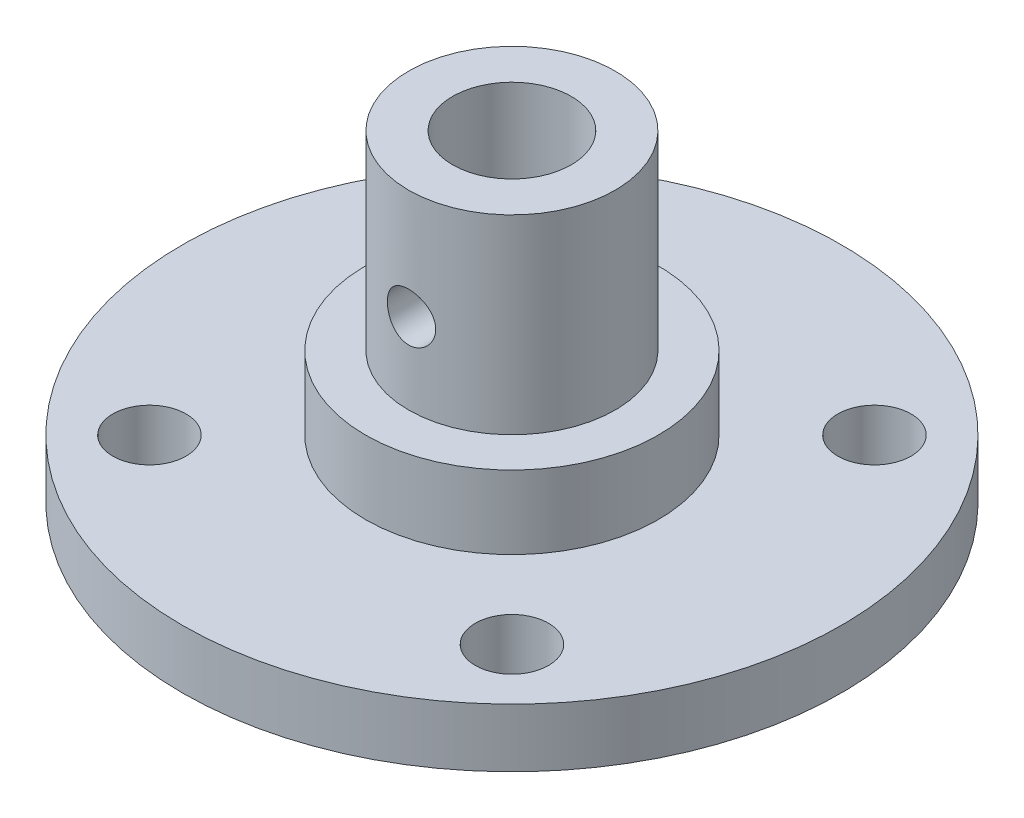
ISO-10303-21;
HEADER;
FILE_DESCRIPTION(('STEP AP214'),'2;1');
FILE_NAME('part.step','',(''),(''),'','','');
FILE_SCHEMA(('AUTOMOTIVE_DESIGN { 1 0 10303 214 1 1 1 1 }'));
ENDSEC;
DATA;
#1=APPLICATION_CONTEXT('core data for automotive mechanical design processes');
#2=APPLICATION_PROTOCOL_DEFINITION('international standard','automotive_design',2000,#1);
#3=PRODUCT_CONTEXT('',#1,'mechanical');
#4=PRODUCT('Part','Part','',(#3));
#5=PRODUCT_RELATED_PRODUCT_CATEGORY('part','',(#4));
#6=PRODUCT_DEFINITION_FORMATION('','',#4);
#7=PRODUCT_DEFINITION_CONTEXT('part definition',#1,'design');
#8=PRODUCT_DEFINITION('design','',#6,#7);
#9=PRODUCT_DEFINITION_SHAPE('','',#8);
#10=(LENGTH_UNIT() NAMED_UNIT(*) SI_UNIT(.MILLI.,.METRE.));
#11=(NAMED_UNIT(*) PLANE_ANGLE_UNIT() SI_UNIT($,.RADIAN.));
#12=(NAMED_UNIT(*) SI_UNIT($,.STERADIAN.) SOLID_ANGLE_UNIT());
#13=UNCERTAINTY_MEASURE_WITH_UNIT(LENGTH_MEASURE(1.E-05),#10,'distance_accuracy_value','');
#14=(GEOMETRIC_REPRESENTATION_CONTEXT(3) GLOBAL_UNCERTAINTY_ASSIGNED_CONTEXT((#13)) GLOBAL_UNIT_ASSIGNED_CONTEXT((#10,
#11,#12)) REPRESENTATION_CONTEXT('',''));
#15=CARTESIAN_POINT('',(0.,0.,0.));
#16=DIRECTION('',(0.,0.,1.));
#17=DIRECTION('',(1.,0.,0.));
#18=AXIS2_PLACEMENT_3D('',#15,#16,#17);
#19=CARTESIAN_POINT('',(0.,22.,0.));
#20=DIRECTION('',(0.,1.,0.));
#21=DIRECTION('',(0.,0.,1.));
#22=AXIS2_PLACEMENT_3D('',#19,#20,#21);
#23=PLANE('',#22);
#24=CARTESIAN_POINT('',(0.,22.,0.));
#25=DIRECTION('',(0.,1.,0.));
#26=DIRECTION('',(0.,0.,1.));
#27=AXIS2_PLACEMENT_3D('',#24,#25,#26);
#28=CIRCLE('',#27,7.05);
#29=CARTESIAN_POINT('',(0.,22.,7.05));
#30=VERTEX_POINT('',#29);
#31=EDGE_CURVE('E143',#30,#30,#28,.T.);
#32=ORIENTED_EDGE('',*,*,#31,.T.);
#33=EDGE_LOOP('',(#32));
#34=FACE_BOUND('',#33,.T.);
#35=CARTESIAN_POINT('',(0.,22.,0.));
#36=DIRECTION('',(0.,1.,0.));
#37=DIRECTION('',(0.,0.,1.));
#38=AXIS2_PLACEMENT_3D('',#35,#36,#37);
#39=CIRCLE('',#38,4.05);
#40=CARTESIAN_POINT('',(0.,22.,4.05));
#41=VERTEX_POINT('',#40);
#42=EDGE_CURVE('E146',#41,#41,#39,.T.);
#43=ORIENTED_EDGE('',*,*,#42,.F.);
#44=EDGE_LOOP('',(#43));
#45=FACE_BOUND('',#44,.T.);
#46=ADVANCED_FACE('F37',(#34,#45),#23,.T.);
#47=CARTESIAN_POINT('',(0.,22.,0.));
#48=DIRECTION('',(0.,-1.,0.));
#49=DIRECTION('',(0.,0.,-1.));
#50=AXIS2_PLACEMENT_3D('',#47,#48,#49);
#51=CYLINDRICAL_SURFACE('',#50,7.05);
#52=CARTESIAN_POINT('',(0.,9.,0.));
#53=DIRECTION('',(0.,1.,0.));
#54=DIRECTION('',(0.,0.,1.));
#55=AXIS2_PLACEMENT_3D('',#52,#53,#54);
#56=CIRCLE('',#55,7.05);
#57=CARTESIAN_POINT('',(0.,9.,7.05));
#58=VERTEX_POINT('',#57);
#59=EDGE_CURVE('E41',#58,#58,#56,.T.);
#60=ORIENTED_EDGE('',*,*,#59,.T.);
#61=EDGE_LOOP('',(#60));
#62=FACE_BOUND('',#61,.T.);
#63=CARTESIAN_POINT('',(0.,16.15,-7.05));
#64=CARTESIAN_POINT('',(-0.0913474700441348,16.1499971257763,-7.04999835860839));
#65=CARTESIAN_POINT('',(-0.182728370967816,16.1423886431707,-7.04820672795841));
#66=CARTESIAN_POINT('',(-0.362883424808443,16.1121939383691,-7.04123285601421));
#67=CARTESIAN_POINT('',(-0.451655859508663,16.0895980650277,-7.03604842995472));
#68=CARTESIAN_POINT('',(-0.623965308754749,16.0301838366564,-7.02286472515679));
#69=CARTESIAN_POINT('',(-0.707508062710386,15.9933814025818,-7.01486859831513));
#70=CARTESIAN_POINT('',(-0.867232140467942,15.9066519235238,-6.99691905683074));
#71=CARTESIAN_POINT('',(-0.943413443157087,15.8567248409002,-6.98696563657471));
#72=CARTESIAN_POINT('',(-1.08764132660066,15.7442016679426,-6.9659845226797));
#73=CARTESIAN_POINT('',(-1.15553464496812,15.6814118953389,-6.95494193286553));
#74=CARTESIAN_POINT('',(-1.27992887383878,15.5453609823451,-6.933129115818));
#75=CARTESIAN_POINT('',(-1.33642864624293,15.4720987971156,-6.92235891588752));
#76=CARTESIAN_POINT('',(-1.43712923093335,15.3160225773181,-6.90216195699853));
#77=CARTESIAN_POINT('',(-1.48116296040951,15.2330980595042,-6.89275420570171));
#78=CARTESIAN_POINT('',(-1.55460848062976,15.0607689192231,-6.87656283506016));
#79=CARTESIAN_POINT('',(-1.58402229510892,14.9713651955924,-6.8697788525539));
#80=CARTESIAN_POINT('',(-1.62687874323924,14.7902891154612,-6.85975553519765));
#81=CARTESIAN_POINT('',(-1.64059477293359,14.6986848943786,-6.85645560287989));
#82=CARTESIAN_POINT('',(-1.65251712844868,14.5144207265445,-6.85359231982514));
#83=CARTESIAN_POINT('',(-1.65072564940748,14.4217609310675,-6.85402844023769));
#84=CARTESIAN_POINT('',(-1.6319029576016,14.2400777279802,-6.85853330792528));
#85=CARTESIAN_POINT('',(-1.61519316183075,14.1510188292118,-6.86252543645042));
#86=CARTESIAN_POINT('',(-1.56751904908242,13.9770046901947,-6.87357091579183));
#87=CARTESIAN_POINT('',(-1.53655382934907,13.8920497102122,-6.88062446047737));
#88=CARTESIAN_POINT('',(-1.46096288699098,13.7277712397107,-6.8970710476079));
#89=CARTESIAN_POINT('',(-1.41621688538256,13.64850522797,-6.90648454762436));
#90=CARTESIAN_POINT('',(-1.31441889943461,13.4984895881465,-6.92657831681793));
#91=CARTESIAN_POINT('',(-1.25736500976729,13.4277412812956,-6.93725878201278));
#92=CARTESIAN_POINT('',(-1.13088665465024,13.2949227773724,-6.95900891879344));
#93=CARTESIAN_POINT('',(-1.06118983333304,13.2331121491263,-6.97008166406616));
#94=CARTESIAN_POINT('',(-0.912290546931962,13.1220106913987,-6.9911279966374));
#95=CARTESIAN_POINT('',(-0.833087857773505,13.0727201571293,-7.00110155801506));
#96=CARTESIAN_POINT('',(-0.66708298943552,12.9879793338773,-7.01886589671544));
#97=CARTESIAN_POINT('',(-0.580260800099777,12.9525669084663,-7.02665068631667));
#98=CARTESIAN_POINT('',(-0.401674346249151,12.8969087908001,-7.03911638744719));
#99=CARTESIAN_POINT('',(-0.309910909998653,12.8766605651137,-7.04379781742919));
#100=CARTESIAN_POINT('',(-0.126269821770627,12.8522920786898,-7.04945414064618));
#101=CARTESIAN_POINT('',(-0.0344415890932761,12.8478177788424,-7.05051038504334));
#102=CARTESIAN_POINT('',(0.148650642925593,12.8541591326668,-7.04902706454207));
#103=CARTESIAN_POINT('',(0.239914685853824,12.8649735899905,-7.04648778099437));
#104=CARTESIAN_POINT('',(0.418087696494507,12.9012926283553,-7.03815044631055));
#105=CARTESIAN_POINT('',(0.505037379117772,12.9266079764561,-7.0323943963023));
#106=CARTESIAN_POINT('',(0.673454249383516,12.9909972594119,-7.01826955541532));
#107=CARTESIAN_POINT('',(0.754920925213545,13.030072476569,-7.00990052103704));
#108=CARTESIAN_POINT('',(0.911497111519642,13.1215853734508,-6.99127988281069));
#109=CARTESIAN_POINT('',(0.986484342548582,13.1742264564218,-6.98100035270794));
#110=CARTESIAN_POINT('',(1.12668736546317,13.2911127510514,-6.95974945986698));
#111=CARTESIAN_POINT('',(1.19190168828445,13.3553597041107,-6.94877799346833));
#112=CARTESIAN_POINT('',(1.31213592520768,13.4952684490656,-6.92709306514746));
#113=CARTESIAN_POINT('',(1.36690905897123,13.5711442638435,-6.91639007929237));
#114=CARTESIAN_POINT('',(1.46293971939007,13.7312232989828,-6.89671803932893));
#115=CARTESIAN_POINT('',(1.50419784943088,13.8154261473602,-6.88774890781893));
#116=CARTESIAN_POINT('',(1.57173173188878,13.9893092215103,-6.87265287252573));
#117=CARTESIAN_POINT('',(1.59809511700833,14.0789538990571,-6.86650938479602));
#118=CARTESIAN_POINT('',(1.63533738775271,14.2615658218623,-6.85773610515183));
#119=CARTESIAN_POINT('',(1.64621917073758,14.3545324420843,-6.85510565578282));
#120=CARTESIAN_POINT('',(1.65205242631933,14.5386506503708,-6.85370189893119));
#121=CARTESIAN_POINT('',(1.64739657048112,14.6297892857877,-6.85483351275164));
#122=CARTESIAN_POINT('',(1.62317444128206,14.8099438799284,-6.86060907154148));
#123=CARTESIAN_POINT('',(1.6036083991977,14.8989598715549,-6.86525296203084));
#124=CARTESIAN_POINT('',(1.55032310233551,15.0719758811152,-6.87748025111632));
#125=CARTESIAN_POINT('',(1.51666884456929,15.1559969360361,-6.88505013827433));
#126=CARTESIAN_POINT('',(1.43621561740372,15.317255708572,-6.90228003695973));
#127=CARTESIAN_POINT('',(1.38941505647352,15.3944926033891,-6.91194030152192));
#128=CARTESIAN_POINT('',(1.28272927430207,15.5419084276022,-6.93254039759688));
#129=CARTESIAN_POINT('',(1.2225676506912,15.6118839589951,-6.943504565116));
#130=CARTESIAN_POINT('',(1.09141763398933,15.7408744439888,-6.96532256366448));
#131=CARTESIAN_POINT('',(1.02042671551188,15.7998868338524,-6.9761763683259));
#132=CARTESIAN_POINT('',(0.868320199475794,15.9061503219366,-6.99674874586923));
#133=CARTESIAN_POINT('',(0.787066062769018,15.9532072317988,-7.00644736281726));
#134=CARTESIAN_POINT('',(0.617586058083398,16.0329194295174,-7.02341195451035));
#135=CARTESIAN_POINT('',(0.529365703639534,16.0655859747891,-7.03067982972086));
#136=CARTESIAN_POINT('',(0.367639236213593,16.1102242514875,-7.0407714154155));
#137=CARTESIAN_POINT('',(0.294961669974412,16.125109954214,-7.04420961291994));
#138=CARTESIAN_POINT('',(0.148196682842116,16.1449987097926,-7.04882450591003));
#139=CARTESIAN_POINT('',(0.0741093433969945,16.1500023318307,-7.05000133164558));
#140=CARTESIAN_POINT('',(0.,16.15,-7.05));
#141=B_SPLINE_CURVE_WITH_KNOTS('',3,(#63,#64,#65,#66,#67,#68,#69,#70,#71,#72,#73,#74,#75,#76,
#77,#78,#79,#80,#81,#82,#83,#84,#85,#86,#87,#88,#89,#90,#91,#92,#93,#94,#95,#96,#97,#98,#99,
#100,#101,#102,#103,#104,#105,#106,#107,#108,#109,#110,#111,#112,#113,#114,#115,#116,#117,#118,
#119,#120,#121,#122,#123,#124,#125,#126,#127,#128,#129,#130,#131,#132,#133,#134,#135,#136,#137,
#138,#139,#140),.UNSPECIFIED.,.T.,.F.,(4,2,2,2,2,2,2,2,2,2,2,2,2,2,2,2,2,2,2,2,2,2,2,2,2,2,2,2,
2,2,2,2,2,2,2,2,2,2,4),(0.,0.273770994728416,0.547718455945723,0.821359797880758,
1.09500192460074,1.37311538834421,1.65125661904034,1.93296613441023,2.21463664378684,
2.4913230718519,2.76797033469765,3.03879730146344,3.3096414212985,3.58291988565354,
3.85624068539375,4.13635864205775,4.4164832030263,4.69736679258467,4.97820344540249,
5.25269523739061,5.52716555153203,5.79813314437955,6.0691259957753,6.34444594305846,
6.61980723503435,6.90103483363954,7.18224987495648,7.46179269204655,7.74128318620695,
8.01376434778368,8.28624128290709,8.55747474382801,8.82874105524693,9.10625176976296,
9.38382729885923,9.66565845599855,9.94726874666306,10.1693893741183,10.3914972075444),.UNSPECIFIED.);
#142=CARTESIAN_POINT('',(0.,16.15,-7.05));
#143=VERTEX_POINT('',#142);
#144=EDGE_CURVE('E94',#143,#143,#141,.T.);
#145=ORIENTED_EDGE('',*,*,#144,.T.);
#146=EDGE_LOOP('',(#145));
#147=FACE_BOUND('',#146,.T.);
#148=CARTESIAN_POINT('',(1.65,14.5,6.85419579527752));
#149=CARTESIAN_POINT('',(1.64999710020304,14.4086911611601,6.85419761836683));
#150=CARTESIAN_POINT('',(1.64239483208734,14.3173488323597,6.85604026387858));
#151=CARTESIAN_POINT('',(1.61222704541117,14.1372738242154,6.86319573610244));
#152=CARTESIAN_POINT('',(1.58965171565924,14.0485428958486,6.86851083812901));
#153=CARTESIAN_POINT('',(1.5302975299503,13.8763214301128,6.8819770340033));
#154=CARTESIAN_POINT('',(1.49353555553602,13.7928248008941,6.89012475600812));
#155=CARTESIAN_POINT('',(1.40690149973241,13.6331787288149,6.90833403073641));
#156=CARTESIAN_POINT('',(1.35702929129515,13.5570293571645,6.91839560200623));
#157=CARTESIAN_POINT('',(1.2445628209213,13.4127684504245,6.93951618701149));
#158=CARTESIAN_POINT('',(1.18176253119232,13.3448195985367,6.95058949605957));
#159=CARTESIAN_POINT('',(1.04566688534741,13.2203173263627,6.97236127579363));
#160=CARTESIAN_POINT('',(0.972370638674521,13.1637648740151,6.98305971457679));
#161=CARTESIAN_POINT('',(0.816261582389973,13.0630066860311,7.0030332151722));
#162=CARTESIAN_POINT('',(0.733344130921933,13.0189590202337,7.01228943934605));
#163=CARTESIAN_POINT('',(0.561030191688626,12.9454858223455,7.02817334211907));
#164=CARTESIAN_POINT('',(0.471634540375596,12.9160584063583,7.0348013593544));
#165=CARTESIAN_POINT('',(0.290595611354747,12.8731771977731,7.04458101228306));
#166=CARTESIAN_POINT('',(0.199020953093845,12.8594476087498,7.04779259899193));
#167=CARTESIAN_POINT('',(0.0148155918313048,12.8474878712856,7.050585816036));
#168=CARTESIAN_POINT('',(-0.0778149720368738,12.8492557038441,7.05016791921956));
#169=CARTESIAN_POINT('',(-0.259595993808582,12.8680385560237,7.04579450940627));
#170=CARTESIAN_POINT('',(-0.348779095449233,12.8847561095222,7.04190801672207));
#171=CARTESIAN_POINT('',(-0.523037518174601,12.9324878846939,7.0311135420495));
#172=CARTESIAN_POINT('',(-0.608112636639273,12.9635028107692,7.02420541119209));
#173=CARTESIAN_POINT('',(-0.772545882384749,13.0392013057794,7.00803541549085));
#174=CARTESIAN_POINT('',(-0.851851696686786,13.0839943411594,6.99875480493153));
#175=CARTESIAN_POINT('',(-1.00192750946546,13.1858952845742,6.97885238153381));
#176=CARTESIAN_POINT('',(-1.07269618739228,13.2430050940055,6.968230361721));
#177=CARTESIAN_POINT('',(-1.20546068843072,13.3695264068779,6.94651017117225));
#178=CARTESIAN_POINT('',(-1.26720790469563,13.4391981255765,6.93540668412343));
#179=CARTESIAN_POINT('',(-1.37819294280704,13.5880235401861,6.91420899140739));
#180=CARTESIAN_POINT('',(-1.4274303182929,13.6671775742853,6.90411482176117));
#181=CARTESIAN_POINT('',(-1.51213115111205,13.8331629720871,6.88606206122414));
#182=CARTESIAN_POINT('',(-1.54754157639143,13.920022356744,6.8781117281928));
#183=CARTESIAN_POINT('',(-1.60318462179719,14.0986905163558,6.865356700298));
#184=CARTESIAN_POINT('',(-1.62342004106163,14.1904983751788,6.86055142532699));
#185=CARTESIAN_POINT('',(-1.64774042060666,14.3741696315711,6.85475058560726));
#186=CARTESIAN_POINT('',(-1.65219001737318,14.4659820881326,6.85366902453307));
#187=CARTESIAN_POINT('',(-1.64580491645887,14.64903711296,6.85520508865632));
#188=CARTESIAN_POINT('',(-1.63497143517329,14.7402797259996,6.85782241945534));
#189=CARTESIAN_POINT('',(-1.59864571380856,14.9182957721915,6.86637957529232));
#190=CARTESIAN_POINT('',(-1.57335969683842,15.0051137461173,6.87227262725991));
#191=CARTESIAN_POINT('',(-1.5090724874086,15.1732800038665,6.88667398352315));
#192=CARTESIAN_POINT('',(-1.47006982990359,15.2546277023154,6.89518256716597));
#193=CARTESIAN_POINT('',(-1.37867228540587,15.4111066165658,6.91404147794497));
#194=CARTESIAN_POINT('',(-1.32605590807335,15.4861048307071,6.924421310546));
#195=CARTESIAN_POINT('',(-1.20920965251348,15.6263412722599,6.94577798641202));
#196=CARTESIAN_POINT('',(-1.14497811195574,15.6915781002032,6.95675491497432));
#197=CARTESIAN_POINT('',(-1.00506355754094,15.8118844281185,6.97835623241658));
#198=CARTESIAN_POINT('',(-0.929162958487524,15.866703575647,6.98896786585951));
#199=CARTESIAN_POINT('',(-0.769019794466528,15.9628149943115,7.00839529084308));
#200=CARTESIAN_POINT('',(-0.684777645537127,16.0041079396301,7.01721117188062));
#201=CARTESIAN_POINT('',(-0.510900757226426,16.0716608418191,7.03200067871923));
#202=CARTESIAN_POINT('',(-0.421307460809341,16.0980230528223,7.03799358899231));
#203=CARTESIAN_POINT('',(-0.238805789769579,16.1352802885775,7.04654582485114));
#204=CARTESIAN_POINT('',(-0.145897973861214,16.1461779076184,7.04910572634314));
#205=CARTESIAN_POINT('',(0.0382308609188985,16.1520659600907,7.05048336419427));
#206=CARTESIAN_POINT('',(0.129439533786052,16.1474280513825,7.04938853518127));
#207=CARTESIAN_POINT('',(0.309739077894009,16.1232174731372,7.04377016495729));
#208=CARTESIAN_POINT('',(0.398829998401515,16.1036451513806,7.03924670358958));
#209=CARTESIAN_POINT('',(0.572029135649095,16.0503099322737,7.02728921016593));
#210=CARTESIAN_POINT('',(0.656156621963106,16.016606688439,7.01986742229068));
#211=CARTESIAN_POINT('',(0.817608433718496,15.9360220659416,7.0029003702831));
#212=CARTESIAN_POINT('',(0.894931998998966,15.8891392172497,6.99335486930046));
#213=CARTESIAN_POINT('',(1.04237055588517,15.7823514753212,6.97292099717567));
#214=CARTESIAN_POINT('',(1.11229596485025,15.7221894770944,6.96200826823773));
#215=CARTESIAN_POINT('',(1.2411851834225,15.5910607223836,6.94019035247552));
#216=CARTESIAN_POINT('',(1.30014628946125,15.5200913088423,6.92928516817028));
#217=CARTESIAN_POINT('',(1.40633984406994,15.3680122192648,6.90852295962363));
#218=CARTESIAN_POINT('',(1.45337218876597,15.2867600020318,6.89868522606308));
#219=CARTESIAN_POINT('',(1.53303895649666,15.1172871802058,6.88142175845062));
#220=CARTESIAN_POINT('',(1.56568476874859,15.0290721532546,6.87399411766182));
#221=CARTESIAN_POINT('',(1.61027697011916,14.8673972347399,6.86366580374711));
#222=CARTESIAN_POINT('',(1.6251427440994,14.7947685215449,6.86013957478938));
#223=CARTESIAN_POINT('',(1.64500511791025,14.6481004892118,6.85540390564564));
#224=CARTESIAN_POINT('',(1.65000235204633,14.5740612610442,6.85419431655656));
#225=CARTESIAN_POINT('',(1.65,14.5,6.85419579527752));
#226=B_SPLINE_CURVE_WITH_KNOTS('',3,(#148,#149,#150,#151,#152,#153,#154,#155,#156,#157,#158,
#159,#160,#161,#162,#163,#164,#165,#166,#167,#168,#169,#170,#171,#172,#173,#174,#175,#176,#177,
#178,#179,#180,#181,#182,#183,#184,#185,#186,#187,#188,#189,#190,#191,#192,#193,#194,#195,#196,
#197,#198,#199,#200,#201,#202,#203,#204,#205,#206,#207,#208,#209,#210,#211,#212,#213,#214,#215,
#216,#217,#218,#219,#220,#221,#222,#223,#224,#225),.UNSPECIFIED.,.T.,.F.,(4,2,2,2,2,2,2,2,2,2,2,
2,2,2,2,2,2,2,2,2,2,2,2,2,2,2,2,2,2,2,2,2,2,2,2,2,2,2,4),(0.,0.273654838505699,
0.547489168428394,0.820998646204724,1.09451077458913,1.3727761236434,1.65106509685523,
1.93272937477138,2.21435734933528,2.49095744390451,2.76752150361109,3.03870206659412,
3.3098959915131,3.58330276546002,3.85675177670432,4.13670271818311,4.41666364712201,
4.69768803533875,4.97866057384454,5.25309908162559,5.52751574780725,5.79811117622259,
6.06873551514448,6.34407487914043,6.61945368018504,6.90078705137317,7.18210639800625,
7.46147506130331,7.74079685309249,8.0134845864265,8.28616596982099,8.55770764126495,
8.82927961199823,9.10666084899614,9.38411039199097,9.66594510818719,9.94755630502204,
10.1695339963429,10.391497419469),.UNSPECIFIED.);
#227=CARTESIAN_POINT('',(1.65,14.5,6.85419579527752));
#228=VERTEX_POINT('',#227);
#229=EDGE_CURVE('E86',#228,#228,#226,.T.);
#230=ORIENTED_EDGE('',*,*,#229,.T.);
#231=EDGE_LOOP('',(#230));
#232=FACE_BOUND('',#231,.T.);
#233=ORIENTED_EDGE('',*,*,#31,.F.);
#234=EDGE_LOOP('',(#233));
#235=FACE_BOUND('',#234,.T.);
#236=ADVANCED_FACE('F101',(#62,#147,#232,#235),#51,.T.);
#237=CARTESIAN_POINT('',(0.,22.,0.));
#238=DIRECTION('',(0.,-1.,0.));
#239=DIRECTION('',(0.,0.,-1.));
#240=AXIS2_PLACEMENT_3D('',#237,#238,#239);
#241=CYLINDRICAL_SURFACE('',#240,4.05);
#242=CARTESIAN_POINT('',(0.,16.15,-4.05));
#243=CARTESIAN_POINT('',(-0.088550707790931,16.14999118965,-4.04999343496065));
#244=CARTESIAN_POINT('',(-0.177248927358013,16.1428291643101,-4.0470619459948));
#245=CARTESIAN_POINT('',(-0.352139131253219,16.1144317186821,-4.03562006615083));
#246=CARTESIAN_POINT('',(-0.438323776526133,16.0931587024413,-4.02709477234193));
#247=CARTESIAN_POINT('',(-0.605373065696626,16.0374477908183,-4.0053828650125));
#248=CARTESIAN_POINT('',(-0.686254360846375,16.0030536658632,-3.99221176025166));
#249=CARTESIAN_POINT('',(-0.841023439909996,15.9222535855427,-3.96249895184923));
#250=CARTESIAN_POINT('',(-0.914913503861032,15.8758515648577,-3.9459583526819));
#251=CARTESIAN_POINT('',(-1.05729645634823,15.7699758229972,-3.91027472249942));
#252=CARTESIAN_POINT('',(-1.12540595487094,15.7100146245375,-3.89104893250371));
#253=CARTESIAN_POINT('',(-1.25092897652607,15.5797522411215,-3.85253113761938));
#254=CARTESIAN_POINT('',(-1.30833709391486,15.5094458622672,-3.83323910425225));
#255=CARTESIAN_POINT('',(-1.41346369879523,15.3565171200759,-3.79577180354529));
#256=CARTESIAN_POINT('',(-1.46060667392953,15.2734737708221,-3.77769033768848));
#257=CARTESIAN_POINT('',(-1.54008404773546,15.0997906624002,-3.74599593853055));
#258=CARTESIAN_POINT('',(-1.57242574242323,15.0091546720068,-3.73238080457352));
#259=CARTESIAN_POINT('',(-1.61981746676573,14.8272684530201,-3.7120522891706));
#260=CARTESIAN_POINT('',(-1.63560328009539,14.7362438116221,-3.70504676375834));
#261=CARTESIAN_POINT('',(-1.65173237797912,14.552588806337,-3.69788672659509));
#262=CARTESIAN_POINT('',(-1.65208365362755,14.4599592982085,-3.6977286696289));
#263=CARTESIAN_POINT('',(-1.63788979415855,14.2829061811839,-3.70403307423587));
#264=CARTESIAN_POINT('',(-1.62442542609953,14.1983754548344,-3.71001521299486));
#265=CARTESIAN_POINT('',(-1.58478928513294,14.0328977157405,-3.72711736315561));
#266=CARTESIAN_POINT('',(-1.55861520170599,13.9519513575247,-3.73823830873142));
#267=CARTESIAN_POINT('',(-1.49379850792552,13.7939458592202,-3.76461253188123));
#268=CARTESIAN_POINT('',(-1.45490777022014,13.717002661451,-3.77994698476034));
#269=CARTESIAN_POINT('',(-1.36593644623418,13.5704442996407,-3.81299960423474));
#270=CARTESIAN_POINT('',(-1.31585156142171,13.5008319657853,-3.83071868548023));
#271=CARTESIAN_POINT('',(-1.20117965862929,13.365016983385,-3.86827959305622));
#272=CARTESIAN_POINT('',(-1.13575005019823,13.2995393101363,-3.88817750671503));
#273=CARTESIAN_POINT('',(-0.994633177440063,13.1802489321156,-3.92664605506927));
#274=CARTESIAN_POINT('',(-0.91894372109659,13.1264387265019,-3.94521640483215));
#275=CARTESIAN_POINT('',(-0.7573349384205,13.0310107497662,-3.97943452879814));
#276=CARTESIAN_POINT('',(-0.67123285280959,12.9896754446381,-3.99501204891112));
#277=CARTESIAN_POINT('',(-0.492501029397024,12.9223278805331,-4.02095473458863));
#278=CARTESIAN_POINT('',(-0.399874764805963,12.8963075364945,-4.03132264997968));
#279=CARTESIAN_POINT('',(-0.216792764969081,12.8618172003213,-4.04517126834939));
#280=CARTESIAN_POINT('',(-0.1265492476224,12.85237352478,-4.04903348631927));
#281=CARTESIAN_POINT('',(0.0543075530294577,12.8484173062685,-4.0506443555359));
#282=CARTESIAN_POINT('',(0.144920729357622,12.8539007125622,-4.04839466536081));
#283=CARTESIAN_POINT('',(0.31946716559677,12.8789351917871,-4.03828329047316));
#284=CARTESIAN_POINT('',(0.40351424985202,12.8978132318859,-4.03069023510639));
#285=CARTESIAN_POINT('',(0.567164345763661,12.9481761364178,-4.01093790016658));
#286=CARTESIAN_POINT('',(0.646766788870265,12.9796626095065,-3.99877803794667));
#287=CARTESIAN_POINT('',(0.80203335476521,13.0553778357026,-3.97059986606492));
#288=CARTESIAN_POINT('',(0.877500368414425,13.0999695417568,-3.95447414792198));
#289=CARTESIAN_POINT('',(1.02014812820659,13.2002285787504,-3.92010077333803));
#290=CARTESIAN_POINT('',(1.08732546964748,13.2559004361207,-3.90185225096538));
#291=CARTESIAN_POINT('',(1.21631383455707,13.381202803088,-3.8636655061736));
#292=CARTESIAN_POINT('',(1.27744302099462,13.4515278327709,-3.84369711212032));
#293=CARTESIAN_POINT('',(1.3872099415236,13.6017763538987,-3.80546131190097));
#294=CARTESIAN_POINT('',(1.4358452872439,13.6817016762937,-3.78719423138942));
#295=CARTESIAN_POINT('',(1.51964368512233,13.8502772138577,-3.75436299729723));
#296=CARTESIAN_POINT('',(1.55464356757076,13.9390180461355,-3.73984435369031));
#297=CARTESIAN_POINT('',(1.60892065790667,14.1219071884977,-3.71682121242864));
#298=CARTESIAN_POINT('',(1.62821006413223,14.2160512423523,-3.70831204941956));
#299=CARTESIAN_POINT('',(1.64933235512858,14.39954567464,-3.69896253968255));
#300=CARTESIAN_POINT('',(1.65235450525243,14.4887332997724,-3.69759993090142));
#301=CARTESIAN_POINT('',(1.64400243763539,14.6662857504901,-3.70132099751837));
#302=CARTESIAN_POINT('',(1.6326302076409,14.7546506879845,-3.70640378286033));
#303=CARTESIAN_POINT('',(1.5967959690617,14.9241865994703,-3.72197479599772));
#304=CARTESIAN_POINT('',(1.5729116218825,15.005503689302,-3.73222377751303));
#305=CARTESIAN_POINT('',(1.51328214179866,15.1630030738707,-3.75679538737239));
#306=CARTESIAN_POINT('',(1.47753370725118,15.2391839321435,-3.77111914952366));
#307=CARTESIAN_POINT('',(1.39277496465012,15.3891134171934,-3.80326756076631));
#308=CARTESIAN_POINT('',(1.34311053053165,15.4624582399579,-3.82124812217269));
#309=CARTESIAN_POINT('',(1.23286792296735,15.6001456992934,-3.85822679510571));
#310=CARTESIAN_POINT('',(1.17228623850897,15.664485427944,-3.87722523259834));
#311=CARTESIAN_POINT('',(1.03700786816779,15.7868520431863,-3.9156587081301));
#312=CARTESIAN_POINT('',(0.961629636781333,15.8441473719249,-3.93503490420199));
#313=CARTESIAN_POINT('',(0.801600406026376,15.9453005682877,-3.97072374426096));
#314=CARTESIAN_POINT('',(0.716945164758662,15.9891522537311,-3.98703497746665));
#315=CARTESIAN_POINT('',(0.542219494047556,16.0611767529638,-4.01449654820316));
#316=CARTESIAN_POINT('',(0.452272119479741,16.0896144926001,-4.02573349594322));
#317=CARTESIAN_POINT('',(0.268486854779753,16.1307126304084,-4.04213529708416));
#318=CARTESIAN_POINT('',(0.174662215787274,16.1434228070969,-4.04731930538543));
#319=CARTESIAN_POINT('',(0.0537209482055293,16.1493468337173,-4.04973472037408));
#320=CARTESIAN_POINT('',(0.0268672639422342,16.1500026731576,-4.05000199190554));
#321=CARTESIAN_POINT('',(0.,16.15,-4.05));
#322=B_SPLINE_CURVE_WITH_KNOTS('',3,(#242,#243,#244,#245,#246,#247,#248,#249,#250,#251,#252,
#253,#254,#255,#256,#257,#258,#259,#260,#261,#262,#263,#264,#265,#266,#267,#268,#269,#270,#271,
#272,#273,#274,#275,#276,#277,#278,#279,#280,#281,#282,#283,#284,#285,#286,#287,#288,#289,#290,
#291,#292,#293,#294,#295,#296,#297,#298,#299,#300,#301,#302,#303,#304,#305,#306,#307,#308,#309,
#310,#311,#312,#313,#314,#315,#316,#317,#318,#319,#320,#321),.UNSPECIFIED.,.T.,.F.,(4,2,2,2,2,2,
2,2,2,2,2,2,2,2,2,2,2,2,2,2,2,2,2,2,2,2,2,2,2,2,2,2,2,2,2,2,2,2,2,4),(0.,0.265578240242927,
0.531866918739049,0.797274950057756,1.06259612382966,1.33965517291132,1.6168537998139,
1.90695717131184,2.19691738731029,2.47336090756097,2.74966129995492,3.00588108257749,
3.26214746124956,3.52374656654219,3.78544629852623,4.0682019410634,4.35101808983701,
4.63982607043941,4.92848144669788,5.19953017743196,5.47050536147858,5.72874954947609,
5.98702669623797,6.25326738822849,6.51961706816289,6.80419398803943,7.08882526833069,
7.37676503029237,7.66448100883867,7.93084467673054,8.19717156598691,8.45216431603517,
8.70722808730107,8.97723125758309,9.24732141696984,9.53586325848502,9.82453759022357,
10.1080789187628,10.3907205102875,10.4712998851556),.UNSPECIFIED.);
#323=CARTESIAN_POINT('',(0.,16.15,-4.05));
#324=VERTEX_POINT('',#323);
#325=EDGE_CURVE('E65',#324,#324,#322,.T.);
#326=ORIENTED_EDGE('',*,*,#325,.F.);
#327=EDGE_LOOP('',(#326));
#328=FACE_BOUND('',#327,.T.);
#329=CARTESIAN_POINT('',(1.65,14.5,3.69864840178139));
#330=CARTESIAN_POINT('',(1.64999104017075,14.4117952818932,3.69865691494103));
#331=CARTESIAN_POINT('',(1.64288249744584,14.3234386678142,3.70184939755506));
#332=CARTESIAN_POINT('',(1.61471741182636,14.1492634797665,3.71421713022117));
#333=CARTESIAN_POINT('',(1.59362224053773,14.0634526243471,3.72340894819068));
#334=CARTESIAN_POINT('',(1.53843018489221,13.8971976987698,3.74654738864502));
#335=CARTESIAN_POINT('',(1.50438471761758,13.8167338644327,3.76047518478405));
#336=CARTESIAN_POINT('',(1.42440888814705,13.6626846641455,3.79148932964761));
#337=CARTESIAN_POINT('',(1.37848170204701,13.5890974671498,3.80857483393882));
#338=CARTESIAN_POINT('',(1.27312660219426,13.4464700806438,3.84511586269538));
#339=CARTESIAN_POINT('',(1.21310459092712,13.3778885223708,3.86464948415869));
#340=CARTESIAN_POINT('',(1.08251235619903,13.2514274340499,3.90324230381037));
#341=CARTESIAN_POINT('',(1.01193818658855,13.1935519258939,3.92230132138918));
#342=CARTESIAN_POINT('',(0.858677633903691,13.0878436379273,3.95873958141969));
#343=CARTESIAN_POINT('',(0.775612352017503,13.040522085542,3.97601743524591));
#344=CARTESIAN_POINT('',(0.60186996206239,12.9607210915261,4.00599625116698));
#345=CARTESIAN_POINT('',(0.511196111914388,12.9282353353421,4.01869916000607));
#346=CARTESIAN_POINT('',(0.329620871684037,12.8806755103455,4.0375436839862));
#347=CARTESIAN_POINT('',(0.238957675808025,12.8648118695648,4.04398168199865));
#348=CARTESIAN_POINT('',(0.0560428733557966,12.8484002331223,4.05064460248112));
#349=CARTESIAN_POINT('',(-0.0362081048690416,12.8478463121475,4.05087192866389));
#350=CARTESIAN_POINT('',(-0.21395752851522,12.8616453837761,4.04526567065675));
#351=CARTESIAN_POINT('',(-0.299536367752997,12.8751321962098,4.03978425418056));
#352=CARTESIAN_POINT('',(-0.467093521346601,12.9151515213928,4.02385503675526));
#353=CARTESIAN_POINT('',(-0.549071570493293,12.9416849933188,4.01340687065774));
#354=CARTESIAN_POINT('',(-0.708590573121727,13.0073663480777,3.98836090916847));
#355=CARTESIAN_POINT('',(-0.786045345695529,13.0466994933331,3.97370256575239));
#356=CARTESIAN_POINT('',(-0.933456539546083,13.1366867115402,3.94168202837445));
#357=CARTESIAN_POINT('',(-1.00341034020361,13.1873447221222,3.92431889460118));
#358=CARTESIAN_POINT('',(-1.13887094290196,13.302542778863,3.88725280011409));
#359=CARTESIAN_POINT('',(-1.20375469944348,13.3677911464546,3.86747101465285));
#360=CARTESIAN_POINT('',(-1.32192060915996,13.5083057865847,3.82869453995795));
#361=CARTESIAN_POINT('',(-1.3751986721174,13.583575575983,3.80970013012411));
#362=CARTESIAN_POINT('',(-1.47014164754159,13.7448844421706,3.77410110829477));
#363=CARTESIAN_POINT('',(-1.51140665585459,13.8311803519983,3.75758613383424));
#364=CARTESIAN_POINT('',(-1.57856811045682,14.0103482574625,3.72987377938777));
#365=CARTESIAN_POINT('',(-1.60447498161071,14.103215744376,3.7186727933829));
#366=CARTESIAN_POINT('',(-1.6386388605904,14.2866620512766,3.70374013469202));
#367=CARTESIAN_POINT('',(-1.64790205905752,14.3770183764402,3.69958358433318));
#368=CARTESIAN_POINT('',(-1.65145947494762,14.5580703615258,3.69799801139255));
#369=CARTESIAN_POINT('',(-1.64575850403359,14.6487659030098,3.7005668262984));
#370=CARTESIAN_POINT('',(-1.62046651522471,14.8221931231402,3.71170518771843));
#371=CARTESIAN_POINT('',(-1.60172972273201,14.9050760696543,3.71990531313061));
#372=CARTESIAN_POINT('',(-1.55201656241098,15.0664610478482,3.74091799095066));
#373=CARTESIAN_POINT('',(-1.52103741632094,15.1449620804847,3.75373159027478));
#374=CARTESIAN_POINT('',(-1.44629157522917,15.2989807448368,3.78317498549337));
#375=CARTESIAN_POINT('',(-1.40204877533808,15.3742405040491,3.79994075531633));
#376=CARTESIAN_POINT('',(-1.30251242986118,15.516618743046,3.83519831902016));
#377=CARTESIAN_POINT('',(-1.2472142566917,15.5837337946312,3.85369083395264));
#378=CARTESIAN_POINT('',(-1.1221029684751,15.713303454883,3.89204078596933));
#379=CARTESIAN_POINT('',(-1.0514990980102,15.7749988597646,3.91189343987333));
#380=CARTESIAN_POINT('',(-0.900472162651407,15.8857920372133,3.9493919637262));
#381=CARTESIAN_POINT('',(-0.820048561562937,15.9348891214099,3.96703771306311));
#382=CARTESIAN_POINT('',(-0.6512612978748,16.0189638362258,3.99821478050242));
#383=CARTESIAN_POINT('',(-0.562890272345121,16.0539282053021,4.01174223124382));
#384=CARTESIAN_POINT('',(-0.380831213794186,16.1082529676001,4.03309398718588));
#385=CARTESIAN_POINT('',(-0.287146222878522,16.1276221940243,4.04092152062082));
#386=CARTESIAN_POINT('',(-0.103921552327221,16.1491302642244,4.04963505470081));
#387=CARTESIAN_POINT('',(-0.0145273363583217,16.1523411853487,4.05095284844184));
#388=CARTESIAN_POINT('',(0.1634873394322,16.1442951183049,4.04767733937384));
#389=CARTESIAN_POINT('',(0.252107922266149,16.133040474046,4.04308499420638));
#390=CARTESIAN_POINT('',(0.423074274930641,16.0971510171189,4.02872622866854));
#391=CARTESIAN_POINT('',(0.505530508173022,16.0729669111868,4.01913435350224));
#392=CARTESIAN_POINT('',(0.665193732458818,16.0123863512506,3.99581447698684));
#393=CARTESIAN_POINT('',(0.742399701062367,15.9759875266885,3.98208567282066));
#394=CARTESIAN_POINT('',(0.893167370573187,15.8901832407972,3.95106830197515));
#395=CARTESIAN_POINT('',(0.966411844059267,15.8402690515859,3.9336480311049));
#396=CARTESIAN_POINT('',(1.10379215350172,15.7296055392138,3.89733245764317));
#397=CARTESIAN_POINT('',(1.16792478415225,15.6688524200724,3.87843663959745));
#398=CARTESIAN_POINT('',(1.28955648416018,15.5336048249921,3.83977572221969));
#399=CARTESIAN_POINT('',(1.34636062640926,15.4584766788761,3.82003319236382));
#400=CARTESIAN_POINT('',(1.44664146469549,15.2991180738922,3.78319897257453));
#401=CARTESIAN_POINT('',(1.49011088197827,15.2148826776404,3.76610873289833));
#402=CARTESIAN_POINT('',(1.56191681981311,15.0401581183601,3.73689912152614));
#403=CARTESIAN_POINT('',(1.59036924906203,14.9497231302933,3.72474184864888));
#404=CARTESIAN_POINT('',(1.63133086156899,14.7648737653393,3.70699067093358));
#405=CARTESIAN_POINT('',(1.64389353068145,14.6704738494345,3.70137475259417));
#406=CARTESIAN_POINT('',(1.6494217980714,14.5505543479902,3.69890513269934));
#407=CARTESIAN_POINT('',(1.6500025682875,14.525283414275,3.69864596152936));
#408=CARTESIAN_POINT('',(1.65,14.5,3.69864840178139));
#409=B_SPLINE_CURVE_WITH_KNOTS('',3,(#329,#330,#331,#332,#333,#334,#335,#336,#337,#338,#339,
#340,#341,#342,#343,#344,#345,#346,#347,#348,#349,#350,#351,#352,#353,#354,#355,#356,#357,#358,
#359,#360,#361,#362,#363,#364,#365,#366,#367,#368,#369,#370,#371,#372,#373,#374,#375,#376,#377,
#378,#379,#380,#381,#382,#383,#384,#385,#386,#387,#388,#389,#390,#391,#392,#393,#394,#395,#396,
#397,#398,#399,#400,#401,#402,#403,#404,#405,#406,#407,#408),.UNSPECIFIED.,.T.,.F.,(4,2,2,2,2,2,
2,2,2,2,2,2,2,2,2,2,2,2,2,2,2,2,2,2,2,2,2,2,2,2,2,2,2,2,2,2,2,2,2,4),(0.,0.264544346333422,
0.529822374013352,0.794057969102516,1.05822300436752,1.33662148119603,1.61512433122709,
1.90508695756781,2.19492605195602,2.47026905789024,2.74550549646898,3.00471438334865,
3.2639423298467,3.5271029383167,3.79035518984885,4.07145542564136,4.35265457043447,
4.64235721439056,4.93186298686545,5.20318876655666,5.47442731332242,5.72938598102462,
5.984402541929,6.24997173410855,6.51565232247806,6.80183323964638,7.08802979037376,
7.37449427586252,7.660796391405,7.92782643060706,8.19481320739572,8.45304794241817,
8.71133282307177,8.98116460963159,9.25109108211793,9.53843242248885,9.82593033006692,
10.111175474342,10.3954578892691,10.4712881220053),.UNSPECIFIED.);
#410=CARTESIAN_POINT('',(1.65,14.5,3.69864840178139));
#411=VERTEX_POINT('',#410);
#412=EDGE_CURVE('E57',#411,#411,#409,.T.);
#413=ORIENTED_EDGE('',*,*,#412,.F.);
#414=EDGE_LOOP('',(#413));
#415=FACE_BOUND('',#414,.T.);
#416=ORIENTED_EDGE('',*,*,#42,.T.);
#417=EDGE_LOOP('',(#416));
#418=FACE_BOUND('',#417,.T.);
#419=CARTESIAN_POINT('',(0.,4.,0.));
#420=DIRECTION('',(0.,1.,0.));
#421=DIRECTION('',(0.,0.,1.));
#422=AXIS2_PLACEMENT_3D('',#419,#420,#421);
#423=CIRCLE('',#422,4.05);
#424=CARTESIAN_POINT('',(0.,4.,4.05));
#425=VERTEX_POINT('',#424);
#426=EDGE_CURVE('E10',#425,#425,#423,.F.);
#427=ORIENTED_EDGE('',*,*,#426,.T.);
#428=EDGE_LOOP('',(#427));
#429=FACE_BOUND('',#428,.T.);
#430=ADVANCED_FACE('F69',(#328,#415,#418,#429),#241,.F.);
#431=CARTESIAN_POINT('',(0.,4.,0.));
#432=DIRECTION('',(0.,1.,0.));
#433=DIRECTION('',(0.,0.,1.));
#434=AXIS2_PLACEMENT_3D('',#431,#432,#433);
#435=PLANE('',#434);
#436=ORIENTED_EDGE('',*,*,#426,.F.);
#437=EDGE_LOOP('',(#436));
#438=FACE_BOUND('',#437,.T.);
#439=ADVANCED_FACE('F127',(#438),#435,.T.);
#440=CARTESIAN_POINT('',(0.,14.5,-9.));
#441=DIRECTION('',(0.,0.,1.));
#442=DIRECTION('',(1.,0.,0.));
#443=AXIS2_PLACEMENT_3D('',#440,#441,#442);
#444=CYLINDRICAL_SURFACE('',#443,1.65);
#445=ORIENTED_EDGE('',*,*,#412,.T.);
#446=EDGE_LOOP('',(#445));
#447=FACE_BOUND('',#446,.T.);
#448=ORIENTED_EDGE('',*,*,#229,.F.);
#449=EDGE_LOOP('',(#448));
#450=FACE_BOUND('',#449,.T.);
#451=ADVANCED_FACE('F77',(#447,#450),#444,.F.);
#452=ORIENTED_EDGE('',*,*,#325,.T.);
#453=EDGE_LOOP('',(#452));
#454=FACE_BOUND('',#453,.T.);
#455=ORIENTED_EDGE('',*,*,#144,.F.);
#456=EDGE_LOOP('',(#455));
#457=FACE_BOUND('',#456,.T.);
#458=ADVANCED_FACE('F72',(#454,#457),#444,.F.);
#459=CARTESIAN_POINT('',(0.,9.,0.));
#460=DIRECTION('',(0.,1.,0.));
#461=DIRECTION('',(0.,0.,1.));
#462=AXIS2_PLACEMENT_3D('',#459,#460,#461);
#463=PLANE('',#462);
#464=ORIENTED_EDGE('',*,*,#59,.F.);
#465=EDGE_LOOP('',(#464));
#466=FACE_BOUND('',#465,.T.);
#467=CARTESIAN_POINT('',(0.,9.,0.));
#468=DIRECTION('',(0.,1.,0.));
#469=DIRECTION('',(0.,0.,1.));
#470=AXIS2_PLACEMENT_3D('',#467,#468,#469);
#471=CIRCLE('',#470,10.);
#472=CARTESIAN_POINT('',(0.,9.,10.));
#473=VERTEX_POINT('',#472);
#474=EDGE_CURVE('E359',#473,#473,#471,.T.);
#475=ORIENTED_EDGE('',*,*,#474,.T.);
#476=EDGE_LOOP('',(#475));
#477=FACE_BOUND('',#476,.T.);
#478=ADVANCED_FACE('F76',(#466,#477),#463,.T.);
#479=CARTESIAN_POINT('',(0.,9.,0.));
#480=DIRECTION('',(0.,-1.,0.));
#481=DIRECTION('',(0.,0.,-1.));
#482=AXIS2_PLACEMENT_3D('',#479,#480,#481);
#483=CYLINDRICAL_SURFACE('',#482,10.);
#484=ORIENTED_EDGE('',*,*,#474,.F.);
#485=EDGE_LOOP('',(#484));
#486=FACE_BOUND('',#485,.T.);
#487=CARTESIAN_POINT('',(0.,4.,0.));
#488=DIRECTION('',(0.,1.,0.));
#489=DIRECTION('',(0.,0.,1.));
#490=AXIS2_PLACEMENT_3D('',#487,#488,#489);
#491=CIRCLE('',#490,10.);
#492=CARTESIAN_POINT('',(0.,4.,10.));
#493=VERTEX_POINT('',#492);
#494=EDGE_CURVE('E95',#493,#493,#491,.T.);
#495=ORIENTED_EDGE('',*,*,#494,.T.);
#496=EDGE_LOOP('',(#495));
#497=FACE_BOUND('',#496,.T.);
#498=ADVANCED_FACE('F79',(#486,#497),#483,.T.);
#499=CARTESIAN_POINT('',(0.,0.,0.));
#500=DIRECTION('',(0.,1.,0.));
#501=DIRECTION('',(0.,0.,1.));
#502=AXIS2_PLACEMENT_3D('',#499,#500,#501);
#503=PLANE('',#502);
#504=CARTESIAN_POINT('',(0.,0.,0.));
#505=DIRECTION('',(0.,1.,0.));
#506=DIRECTION('',(0.,0.,1.));
#507=AXIS2_PLACEMENT_3D('',#504,#505,#506);
#508=CIRCLE('',#507,22.5);
#509=CARTESIAN_POINT('',(0.,0.,22.5));
#510=VERTEX_POINT('',#509);
#511=EDGE_CURVE('E53',#510,#510,#508,.T.);
#512=ORIENTED_EDGE('',*,*,#511,.F.);
#513=EDGE_LOOP('',(#512));
#514=FACE_BOUND('',#513,.T.);
#515=CARTESIAN_POINT('',(-12.3743686707644,0.,-12.3743686707648));
#516=DIRECTION('',(0.,1.,0.));
#517=DIRECTION('',(0.,0.,1.));
#518=AXIS2_PLACEMENT_3D('',#515,#516,#517);
#519=CIRCLE('',#518,2.5);
#520=CARTESIAN_POINT('',(-12.3743686707644,0.,-9.87436867076478));
#521=VERTEX_POINT('',#520);
#522=EDGE_CURVE('E176',#521,#521,#519,.T.);
#523=ORIENTED_EDGE('',*,*,#522,.T.);
#524=EDGE_LOOP('',(#523));
#525=FACE_BOUND('',#524,.T.);
#526=CARTESIAN_POINT('',(12.3743686707647,0.,-12.3743686707645));
#527=DIRECTION('',(0.,1.,0.));
#528=DIRECTION('',(0.,0.,1.));
#529=AXIS2_PLACEMENT_3D('',#526,#527,#528);
#530=CIRCLE('',#529,2.5);
#531=CARTESIAN_POINT('',(12.3743686707647,0.,-9.87436867076452));
#532=VERTEX_POINT('',#531);
#533=EDGE_CURVE('E168',#532,#532,#530,.T.);
#534=ORIENTED_EDGE('',*,*,#533,.T.);
#535=EDGE_LOOP('',(#534));
#536=FACE_BOUND('',#535,.T.);
#537=CARTESIAN_POINT('',(12.3743686707645,0.,12.3743686707647));
#538=DIRECTION('',(0.,1.,0.));
#539=DIRECTION('',(0.,0.,1.));
#540=AXIS2_PLACEMENT_3D('',#537,#538,#539);
#541=CIRCLE('',#540,2.5);
#542=CARTESIAN_POINT('',(12.3743686707645,0.,14.8743686707647));
#543=VERTEX_POINT('',#542);
#544=EDGE_CURVE('E160',#543,#543,#541,.T.);
#545=ORIENTED_EDGE('',*,*,#544,.T.);
#546=EDGE_LOOP('',(#545));
#547=FACE_BOUND('',#546,.T.);
#548=CARTESIAN_POINT('',(-12.3743686707647,0.,12.3743686707644));
#549=DIRECTION('',(0.,1.,0.));
#550=DIRECTION('',(0.,0.,1.));
#551=AXIS2_PLACEMENT_3D('',#548,#549,#550);
#552=CIRCLE('',#551,2.5);
#553=CARTESIAN_POINT('',(-12.3743686707647,0.,14.8743686707644));
#554=VERTEX_POINT('',#553);
#555=EDGE_CURVE('E152',#554,#554,#552,.T.);
#556=ORIENTED_EDGE('',*,*,#555,.T.);
#557=EDGE_LOOP('',(#556));
#558=FACE_BOUND('',#557,.T.);
#559=ADVANCED_FACE('F111',(#514,#525,#536,#547,#558),#503,.F.);
#560=CARTESIAN_POINT('',(-12.3743686707647,4.,12.3743686707644));
#561=DIRECTION('',(0.,-1.,0.));
#562=DIRECTION('',(0.,0.,-1.));
#563=AXIS2_PLACEMENT_3D('',#560,#561,#562);
#564=CYLINDRICAL_SURFACE('',#563,2.5);
#565=CARTESIAN_POINT('',(-12.3743686707647,4.,12.3743686707644));
#566=DIRECTION('',(0.,1.,0.));
#567=DIRECTION('',(0.,0.,1.));
#568=AXIS2_PLACEMENT_3D('',#565,#566,#567);
#569=CIRCLE('',#568,2.5);
#570=CARTESIAN_POINT('',(-12.3743686707647,4.,14.8743686707644));
#571=VERTEX_POINT('',#570);
#572=EDGE_CURVE('E156',#571,#571,#569,.T.);
#573=ORIENTED_EDGE('',*,*,#572,.T.);
#574=EDGE_LOOP('',(#573));
#575=FACE_BOUND('',#574,.T.);
#576=ORIENTED_EDGE('',*,*,#555,.F.);
#577=EDGE_LOOP('',(#576));
#578=FACE_BOUND('',#577,.T.);
#579=ADVANCED_FACE('F106',(#575,#578),#564,.F.);
#580=CARTESIAN_POINT('',(12.3743686707647,4.,-12.3743686707645));
#581=DIRECTION('',(0.,-1.,0.));
#582=DIRECTION('',(0.,0.,-1.));
#583=AXIS2_PLACEMENT_3D('',#580,#581,#582);
#584=CYLINDRICAL_SURFACE('',#583,2.5);
#585=CARTESIAN_POINT('',(12.3743686707647,4.,-12.3743686707645));
#586=DIRECTION('',(0.,1.,0.));
#587=DIRECTION('',(0.,0.,1.));
#588=AXIS2_PLACEMENT_3D('',#585,#586,#587);
#589=CIRCLE('',#588,2.5);
#590=CARTESIAN_POINT('',(12.3743686707647,4.,-9.87436867076452));
#591=VERTEX_POINT('',#590);
#592=EDGE_CURVE('E172',#591,#591,#589,.T.);
#593=ORIENTED_EDGE('',*,*,#592,.T.);
#594=EDGE_LOOP('',(#593));
#595=FACE_BOUND('',#594,.T.);
#596=ORIENTED_EDGE('',*,*,#533,.F.);
#597=EDGE_LOOP('',(#596));
#598=FACE_BOUND('',#597,.T.);
#599=ADVANCED_FACE('F110',(#595,#598),#584,.F.);
#600=CARTESIAN_POINT('',(0.,4.,0.));
#601=DIRECTION('',(0.,-1.,0.));
#602=DIRECTION('',(0.,0.,-1.));
#603=AXIS2_PLACEMENT_3D('',#600,#601,#602);
#604=CYLINDRICAL_SURFACE('',#603,22.5);
#605=CARTESIAN_POINT('',(0.,4.,0.));
#606=DIRECTION('',(0.,1.,0.));
#607=DIRECTION('',(0.,0.,1.));
#608=AXIS2_PLACEMENT_3D('',#605,#606,#607);
#609=CIRCLE('',#608,22.5);
#610=CARTESIAN_POINT('',(0.,4.,22.5));
#611=VERTEX_POINT('',#610);
#612=EDGE_CURVE('E46',#611,#611,#609,.T.);
#613=ORIENTED_EDGE('',*,*,#612,.F.);
#614=EDGE_LOOP('',(#613));
#615=FACE_BOUND('',#614,.T.);
#616=ORIENTED_EDGE('',*,*,#511,.T.);
#617=EDGE_LOOP('',(#616));
#618=FACE_BOUND('',#617,.T.);
#619=ADVANCED_FACE('F39',(#615,#618),#604,.T.);
#620=CARTESIAN_POINT('',(-12.3743686707644,4.,-12.3743686707648));
#621=DIRECTION('',(0.,-1.,0.));
#622=DIRECTION('',(0.,0.,-1.));
#623=AXIS2_PLACEMENT_3D('',#620,#621,#622);
#624=CYLINDRICAL_SURFACE('',#623,2.5);
#625=CARTESIAN_POINT('',(-12.3743686707644,4.,-12.3743686707648));
#626=DIRECTION('',(0.,1.,0.));
#627=DIRECTION('',(0.,0.,1.));
#628=AXIS2_PLACEMENT_3D('',#625,#626,#627);
#629=CIRCLE('',#628,2.5);
#630=CARTESIAN_POINT('',(-12.3743686707644,4.,-9.87436867076478));
#631=VERTEX_POINT('',#630);
#632=EDGE_CURVE('E180',#631,#631,#629,.T.);
#633=ORIENTED_EDGE('',*,*,#632,.T.);
#634=EDGE_LOOP('',(#633));
#635=FACE_BOUND('',#634,.T.);
#636=ORIENTED_EDGE('',*,*,#522,.F.);
#637=EDGE_LOOP('',(#636));
#638=FACE_BOUND('',#637,.T.);
#639=ADVANCED_FACE('F117',(#635,#638),#624,.F.);
#640=CARTESIAN_POINT('',(12.3743686707645,4.,12.3743686707647));
#641=DIRECTION('',(0.,-1.,0.));
#642=DIRECTION('',(0.,0.,-1.));
#643=AXIS2_PLACEMENT_3D('',#640,#641,#642);
#644=CYLINDRICAL_SURFACE('',#643,2.5);
#645=CARTESIAN_POINT('',(12.3743686707645,4.,12.3743686707647));
#646=DIRECTION('',(0.,1.,0.));
#647=DIRECTION('',(0.,0.,1.));
#648=AXIS2_PLACEMENT_3D('',#645,#646,#647);
#649=CIRCLE('',#648,2.5);
#650=CARTESIAN_POINT('',(12.3743686707645,4.,14.8743686707647));
#651=VERTEX_POINT('',#650);
#652=EDGE_CURVE('E164',#651,#651,#649,.T.);
#653=ORIENTED_EDGE('',*,*,#652,.T.);
#654=EDGE_LOOP('',(#653));
#655=FACE_BOUND('',#654,.T.);
#656=ORIENTED_EDGE('',*,*,#544,.F.);
#657=EDGE_LOOP('',(#656));
#658=FACE_BOUND('',#657,.T.);
#659=ADVANCED_FACE('F113',(#655,#658),#644,.F.);
#660=ORIENTED_EDGE('',*,*,#494,.F.);
#661=EDGE_LOOP('',(#660));
#662=FACE_BOUND('',#661,.T.);
#663=ORIENTED_EDGE('',*,*,#652,.F.);
#664=EDGE_LOOP('',(#663));
#665=FACE_BOUND('',#664,.T.);
#666=ORIENTED_EDGE('',*,*,#632,.F.);
#667=EDGE_LOOP('',(#666));
#668=FACE_BOUND('',#667,.T.);
#669=ORIENTED_EDGE('',*,*,#612,.T.);
#670=EDGE_LOOP('',(#669));
#671=FACE_BOUND('',#670,.T.);
#672=ORIENTED_EDGE('',*,*,#592,.F.);
#673=EDGE_LOOP('',(#672));
#674=FACE_BOUND('',#673,.T.);
#675=ORIENTED_EDGE('',*,*,#572,.F.);
#676=EDGE_LOOP('',(#675));
#677=FACE_BOUND('',#676,.T.);
#678=ADVANCED_FACE('F116',(#662,#665,#668,#671,#674,#677),#435,.T.);
#679=CLOSED_SHELL('',(#46,#236,#430,#439,#451,#458,#478,#498,#559,#579,#599,#619,#639,#659,#678));
#680=MANIFOLD_SOLID_BREP('B2',#679);
#681=ADVANCED_BREP_SHAPE_REPRESENTATION('',(#18,#680),#14);
#682=SHAPE_DEFINITION_REPRESENTATION(#9,#681);
ENDSEC;
END-ISO-10303-21;
